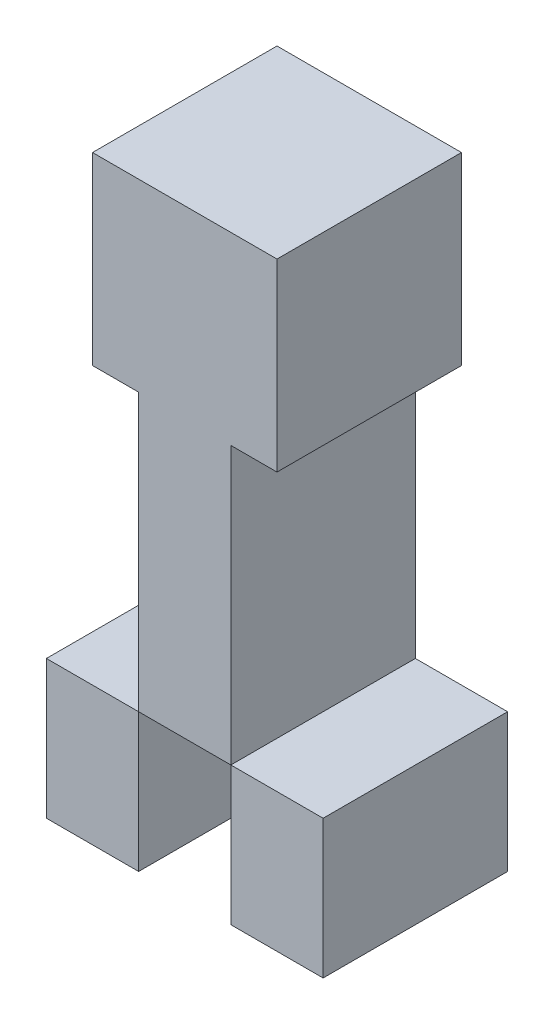
ISO-10303-21;
HEADER;
FILE_DESCRIPTION(('STEP AP214'),'2;1');
FILE_NAME('part.step','',(''),(''),'','','');
FILE_SCHEMA(('AUTOMOTIVE_DESIGN { 1 0 10303 214 1 1 1 1 }'));
ENDSEC;
DATA;
#1=APPLICATION_CONTEXT('core data for automotive mechanical design processes');
#2=APPLICATION_PROTOCOL_DEFINITION('international standard','automotive_design',2000,#1);
#3=PRODUCT_CONTEXT('',#1,'mechanical');
#4=PRODUCT('Part','Part','',(#3));
#5=PRODUCT_RELATED_PRODUCT_CATEGORY('part','',(#4));
#6=PRODUCT_DEFINITION_FORMATION('','',#4);
#7=PRODUCT_DEFINITION_CONTEXT('part definition',#1,'design');
#8=PRODUCT_DEFINITION('design','',#6,#7);
#9=PRODUCT_DEFINITION_SHAPE('','',#8);
#10=(LENGTH_UNIT() NAMED_UNIT(*) SI_UNIT(.MILLI.,.METRE.));
#11=(NAMED_UNIT(*) PLANE_ANGLE_UNIT() SI_UNIT($,.RADIAN.));
#12=(NAMED_UNIT(*) SI_UNIT($,.STERADIAN.) SOLID_ANGLE_UNIT());
#13=UNCERTAINTY_MEASURE_WITH_UNIT(LENGTH_MEASURE(1.E-05),#10,'distance_accuracy_value','');
#14=(GEOMETRIC_REPRESENTATION_CONTEXT(3) GLOBAL_UNCERTAINTY_ASSIGNED_CONTEXT((#13)) GLOBAL_UNIT_ASSIGNED_CONTEXT((#10,
#11,#12)) REPRESENTATION_CONTEXT('',''));
#15=CARTESIAN_POINT('',(0.,0.,0.));
#16=DIRECTION('',(0.,0.,1.));
#17=DIRECTION('',(1.,0.,0.));
#18=AXIS2_PLACEMENT_3D('',#15,#16,#17);
#19=CARTESIAN_POINT('',(0.,114.,0.));
#20=DIRECTION('',(0.,1.,0.));
#21=DIRECTION('',(0.,0.,1.));
#22=AXIS2_PLACEMENT_3D('',#19,#20,#21);
#23=PLANE('',#22);
#24=DIRECTION('',(0.,0.,1.));
#25=VECTOR('',#24,1.);
#26=CARTESIAN_POINT('',(-38.,114.,-152.));
#27=LINE('',#26,#25);
#28=CARTESIAN_POINT('',(-38.,114.,-152.));
#29=VERTEX_POINT('',#28);
#30=CARTESIAN_POINT('',(-38.,114.,0.));
#31=VERTEX_POINT('',#30);
#32=EDGE_CURVE('E208',#29,#31,#27,.T.);
#33=ORIENTED_EDGE('',*,*,#32,.F.);
#34=DIRECTION('',(-1.,0.,0.));
#35=VECTOR('',#34,1.);
#36=CARTESIAN_POINT('',(-38.,114.,-152.));
#37=LINE('',#36,#35);
#38=CARTESIAN_POINT('',(38.,114.,-152.));
#39=VERTEX_POINT('',#38);
#40=EDGE_CURVE('E213',#39,#29,#37,.T.);
#41=ORIENTED_EDGE('',*,*,#40,.F.);
#42=DIRECTION('',(0.,0.,-1.));
#43=VECTOR('',#42,1.);
#44=CARTESIAN_POINT('',(38.,114.,-152.));
#45=LINE('',#44,#43);
#46=CARTESIAN_POINT('',(38.,114.,0.));
#47=VERTEX_POINT('',#46);
#48=EDGE_CURVE('E221',#47,#39,#45,.T.);
#49=ORIENTED_EDGE('',*,*,#48,.F.);
#50=DIRECTION('',(1.,0.,0.));
#51=VECTOR('',#50,1.);
#52=CARTESIAN_POINT('',(-38.,114.,0.));
#53=LINE('',#52,#51);
#54=EDGE_CURVE('E219',#31,#47,#53,.T.);
#55=ORIENTED_EDGE('',*,*,#54,.F.);
#56=EDGE_LOOP('',(#33,#41,#49,#55));
#57=FACE_BOUND('',#56,.T.);
#58=DIRECTION('',(0.,0.,1.));
#59=VECTOR('',#58,1.);
#60=CARTESIAN_POINT('',(-35.,114.,-149.));
#61=LINE('',#60,#59);
#62=CARTESIAN_POINT('',(-35.,114.,-149.));
#63=VERTEX_POINT('',#62);
#64=CARTESIAN_POINT('',(-35.,114.,-3.));
#65=VERTEX_POINT('',#64);
#66=EDGE_CURVE('E71',#63,#65,#61,.T.);
#67=ORIENTED_EDGE('',*,*,#66,.T.);
#68=DIRECTION('',(1.,0.,0.));
#69=VECTOR('',#68,1.);
#70=CARTESIAN_POINT('',(-35.,114.,-3.));
#71=LINE('',#70,#69);
#72=CARTESIAN_POINT('',(35.,114.,-3.));
#73=VERTEX_POINT('',#72);
#74=EDGE_CURVE('E193',#65,#73,#71,.T.);
#75=ORIENTED_EDGE('',*,*,#74,.T.);
#76=DIRECTION('',(0.,0.,-1.));
#77=VECTOR('',#76,1.);
#78=CARTESIAN_POINT('',(35.,114.,-149.));
#79=LINE('',#78,#77);
#80=CARTESIAN_POINT('',(35.,114.,-149.));
#81=VERTEX_POINT('',#80);
#82=EDGE_CURVE('E196',#73,#81,#79,.T.);
#83=ORIENTED_EDGE('',*,*,#82,.T.);
#84=DIRECTION('',(-1.,0.,0.));
#85=VECTOR('',#84,1.);
#86=CARTESIAN_POINT('',(-35.,114.,-149.));
#87=LINE('',#86,#85);
#88=EDGE_CURVE('E184',#81,#63,#87,.T.);
#89=ORIENTED_EDGE('',*,*,#88,.T.);
#90=EDGE_LOOP('',(#67,#75,#83,#89));
#91=FACE_BOUND('',#90,.T.);
#92=ADVANCED_FACE('F48',(#57,#91),#23,.F.);
#93=CARTESIAN_POINT('',(-38.,342.,-152.));
#94=DIRECTION('',(1.,0.,0.));
#95=DIRECTION('',(0.,0.,-1.));
#96=AXIS2_PLACEMENT_3D('',#93,#94,#95);
#97=PLANE('',#96);
#98=ORIENTED_EDGE('',*,*,#32,.T.);
#99=DIRECTION('',(0.,-1.,0.));
#100=VECTOR('',#99,1.);
#101=CARTESIAN_POINT('',(-38.,342.,0.));
#102=LINE('',#101,#100);
#103=CARTESIAN_POINT('',(-38.,342.,0.));
#104=VERTEX_POINT('',#103);
#105=EDGE_CURVE('E12',#104,#31,#102,.T.);
#106=ORIENTED_EDGE('',*,*,#105,.F.);
#107=DIRECTION('',(0.,0.,1.));
#108=VECTOR('',#107,1.);
#109=CARTESIAN_POINT('',(-38.,342.,-152.));
#110=LINE('',#109,#108);
#111=CARTESIAN_POINT('',(-38.,342.,-152.));
#112=VERTEX_POINT('',#111);
#113=EDGE_CURVE('E209',#112,#104,#110,.T.);
#114=ORIENTED_EDGE('',*,*,#113,.F.);
#115=DIRECTION('',(0.,-1.,0.));
#116=VECTOR('',#115,1.);
#117=CARTESIAN_POINT('',(-38.,342.,-152.));
#118=LINE('',#117,#116);
#119=EDGE_CURVE('E216',#112,#29,#118,.T.);
#120=ORIENTED_EDGE('',*,*,#119,.T.);
#121=EDGE_LOOP('',(#98,#106,#114,#120));
#122=FACE_BOUND('',#121,.T.);
#123=ADVANCED_FACE('F50',(#122),#97,.F.);
#124=CARTESIAN_POINT('',(-38.,342.,0.));
#125=DIRECTION('',(0.,0.,-1.));
#126=DIRECTION('',(-1.,0.,0.));
#127=AXIS2_PLACEMENT_3D('',#124,#125,#126);
#128=PLANE('',#127);
#129=ORIENTED_EDGE('',*,*,#54,.T.);
#130=DIRECTION('',(0.,-1.,0.));
#131=VECTOR('',#130,1.);
#132=CARTESIAN_POINT('',(38.,342.,0.));
#133=LINE('',#132,#131);
#134=CARTESIAN_POINT('',(38.,342.,0.));
#135=VERTEX_POINT('',#134);
#136=EDGE_CURVE('E56',#135,#47,#133,.T.);
#137=ORIENTED_EDGE('',*,*,#136,.F.);
#138=DIRECTION('',(1.,0.,0.));
#139=VECTOR('',#138,1.);
#140=CARTESIAN_POINT('',(-76.,342.,0.));
#141=LINE('',#140,#139);
#142=CARTESIAN_POINT('',(76.,342.,0.));
#143=VERTEX_POINT('',#142);
#144=EDGE_CURVE('E246',#135,#143,#141,.T.);
#145=ORIENTED_EDGE('',*,*,#144,.T.);
#146=DIRECTION('',(0.,1.,0.));
#147=VECTOR('',#146,1.);
#148=CARTESIAN_POINT('',(76.,494.,0.));
#149=LINE('',#148,#147);
#150=CARTESIAN_POINT('',(76.,494.,0.));
#151=VERTEX_POINT('',#150);
#152=EDGE_CURVE('E174',#143,#151,#149,.T.);
#153=ORIENTED_EDGE('',*,*,#152,.T.);
#154=DIRECTION('',(-1.,0.,0.));
#155=VECTOR('',#154,1.);
#156=CARTESIAN_POINT('',(-76.,494.,0.));
#157=LINE('',#156,#155);
#158=CARTESIAN_POINT('',(-76.,494.,0.));
#159=VERTEX_POINT('',#158);
#160=EDGE_CURVE('E178',#151,#159,#157,.T.);
#161=ORIENTED_EDGE('',*,*,#160,.T.);
#162=DIRECTION('',(0.,-1.,0.));
#163=VECTOR('',#162,1.);
#164=CARTESIAN_POINT('',(-76.,494.,0.));
#165=LINE('',#164,#163);
#166=CARTESIAN_POINT('',(-76.,342.,0.));
#167=VERTEX_POINT('',#166);
#168=EDGE_CURVE('E146',#159,#167,#165,.T.);
#169=ORIENTED_EDGE('',*,*,#168,.T.);
#170=EDGE_CURVE('E245',#167,#104,#141,.T.);
#171=ORIENTED_EDGE('',*,*,#170,.T.);
#172=ORIENTED_EDGE('',*,*,#105,.T.);
#173=EDGE_LOOP('',(#129,#137,#145,#153,#161,#169,#171,#172));
#174=FACE_BOUND('',#173,.T.);
#175=ADVANCED_FACE('F249',(#174),#128,.F.);
#176=CARTESIAN_POINT('',(38.,342.,-152.));
#177=DIRECTION('',(-1.,0.,0.));
#178=DIRECTION('',(0.,0.,1.));
#179=AXIS2_PLACEMENT_3D('',#176,#177,#178);
#180=PLANE('',#179);
#181=ORIENTED_EDGE('',*,*,#48,.T.);
#182=DIRECTION('',(0.,-1.,0.));
#183=VECTOR('',#182,1.);
#184=CARTESIAN_POINT('',(38.,342.,-152.));
#185=LINE('',#184,#183);
#186=CARTESIAN_POINT('',(38.,342.,-152.));
#187=VERTEX_POINT('',#186);
#188=EDGE_CURVE('E226',#187,#39,#185,.T.);
#189=ORIENTED_EDGE('',*,*,#188,.F.);
#190=DIRECTION('',(0.,0.,-1.));
#191=VECTOR('',#190,1.);
#192=CARTESIAN_POINT('',(38.,342.,-152.));
#193=LINE('',#192,#191);
#194=EDGE_CURVE('E212',#135,#187,#193,.T.);
#195=ORIENTED_EDGE('',*,*,#194,.F.);
#196=ORIENTED_EDGE('',*,*,#136,.T.);
#197=EDGE_LOOP('',(#181,#189,#195,#196));
#198=FACE_BOUND('',#197,.T.);
#199=ADVANCED_FACE('F232',(#198),#180,.F.);
#200=CARTESIAN_POINT('',(-38.,342.,-152.));
#201=DIRECTION('',(0.,0.,1.));
#202=DIRECTION('',(1.,0.,0.));
#203=AXIS2_PLACEMENT_3D('',#200,#201,#202);
#204=PLANE('',#203);
#205=ORIENTED_EDGE('',*,*,#40,.T.);
#206=ORIENTED_EDGE('',*,*,#119,.F.);
#207=DIRECTION('',(-1.,0.,0.));
#208=VECTOR('',#207,1.);
#209=CARTESIAN_POINT('',(-76.,342.,-152.));
#210=LINE('',#209,#208);
#211=CARTESIAN_POINT('',(-76.,342.,-152.));
#212=VERTEX_POINT('',#211);
#213=EDGE_CURVE('E163',#112,#212,#210,.T.);
#214=ORIENTED_EDGE('',*,*,#213,.T.);
#215=DIRECTION('',(0.,1.,0.));
#216=VECTOR('',#215,1.);
#217=CARTESIAN_POINT('',(-76.,494.,-152.));
#218=LINE('',#217,#216);
#219=CARTESIAN_POINT('',(-76.,494.,-152.));
#220=VERTEX_POINT('',#219);
#221=EDGE_CURVE('E145',#212,#220,#218,.T.);
#222=ORIENTED_EDGE('',*,*,#221,.T.);
#223=DIRECTION('',(1.,0.,0.));
#224=VECTOR('',#223,1.);
#225=CARTESIAN_POINT('',(-76.,494.,-152.));
#226=LINE('',#225,#224);
#227=CARTESIAN_POINT('',(76.,494.,-152.));
#228=VERTEX_POINT('',#227);
#229=EDGE_CURVE('E153',#220,#228,#226,.T.);
#230=ORIENTED_EDGE('',*,*,#229,.T.);
#231=DIRECTION('',(0.,-1.,0.));
#232=VECTOR('',#231,1.);
#233=CARTESIAN_POINT('',(76.,494.,-152.));
#234=LINE('',#233,#232);
#235=CARTESIAN_POINT('',(76.,342.,-152.));
#236=VERTEX_POINT('',#235);
#237=EDGE_CURVE('E159',#228,#236,#234,.T.);
#238=ORIENTED_EDGE('',*,*,#237,.T.);
#239=EDGE_CURVE('E150',#236,#187,#210,.T.);
#240=ORIENTED_EDGE('',*,*,#239,.T.);
#241=ORIENTED_EDGE('',*,*,#188,.T.);
#242=EDGE_LOOP('',(#205,#206,#214,#222,#230,#238,#240,#241));
#243=FACE_BOUND('',#242,.T.);
#244=ADVANCED_FACE('F161',(#243),#204,.F.);
#245=CARTESIAN_POINT('',(-35.,342.,-149.));
#246=DIRECTION('',(1.,0.,0.));
#247=DIRECTION('',(0.,0.,-1.));
#248=AXIS2_PLACEMENT_3D('',#245,#246,#247);
#249=PLANE('',#248);
#250=ORIENTED_EDGE('',*,*,#66,.F.);
#251=DIRECTION('',(0.,-1.,0.));
#252=VECTOR('',#251,1.);
#253=CARTESIAN_POINT('',(-35.,342.,-149.));
#254=LINE('',#253,#252);
#255=CARTESIAN_POINT('',(-35.,342.,-149.));
#256=VERTEX_POINT('',#255);
#257=EDGE_CURVE('E191',#256,#63,#254,.T.);
#258=ORIENTED_EDGE('',*,*,#257,.F.);
#259=DIRECTION('',(0.,0.,1.));
#260=VECTOR('',#259,1.);
#261=CARTESIAN_POINT('',(-35.,342.,-149.));
#262=LINE('',#261,#260);
#263=CARTESIAN_POINT('',(-35.,342.,-3.));
#264=VERTEX_POINT('',#263);
#265=EDGE_CURVE('E180',#256,#264,#262,.T.);
#266=ORIENTED_EDGE('',*,*,#265,.T.);
#267=DIRECTION('',(0.,-1.,0.));
#268=VECTOR('',#267,1.);
#269=CARTESIAN_POINT('',(-35.,342.,-3.));
#270=LINE('',#269,#268);
#271=EDGE_CURVE('E206',#264,#65,#270,.T.);
#272=ORIENTED_EDGE('',*,*,#271,.T.);
#273=EDGE_LOOP('',(#250,#258,#266,#272));
#274=FACE_BOUND('',#273,.T.);
#275=ADVANCED_FACE('F275',(#274),#249,.T.);
#276=CARTESIAN_POINT('',(-35.,342.,-3.));
#277=DIRECTION('',(0.,0.,-1.));
#278=DIRECTION('',(-1.,0.,0.));
#279=AXIS2_PLACEMENT_3D('',#276,#277,#278);
#280=PLANE('',#279);
#281=ORIENTED_EDGE('',*,*,#74,.F.);
#282=ORIENTED_EDGE('',*,*,#271,.F.);
#283=DIRECTION('',(1.,0.,0.));
#284=VECTOR('',#283,1.);
#285=CARTESIAN_POINT('',(-35.,342.,-3.));
#286=LINE('',#285,#284);
#287=CARTESIAN_POINT('',(35.,342.,-3.));
#288=VERTEX_POINT('',#287);
#289=EDGE_CURVE('E183',#264,#288,#286,.T.);
#290=ORIENTED_EDGE('',*,*,#289,.T.);
#291=DIRECTION('',(0.,-1.,0.));
#292=VECTOR('',#291,1.);
#293=CARTESIAN_POINT('',(35.,342.,-3.));
#294=LINE('',#293,#292);
#295=EDGE_CURVE('E204',#288,#73,#294,.T.);
#296=ORIENTED_EDGE('',*,*,#295,.T.);
#297=EDGE_LOOP('',(#281,#282,#290,#296));
#298=FACE_BOUND('',#297,.T.);
#299=ADVANCED_FACE('F299',(#298),#280,.T.);
#300=CARTESIAN_POINT('',(35.,342.,-149.));
#301=DIRECTION('',(-1.,0.,0.));
#302=DIRECTION('',(0.,0.,1.));
#303=AXIS2_PLACEMENT_3D('',#300,#301,#302);
#304=PLANE('',#303);
#305=ORIENTED_EDGE('',*,*,#82,.F.);
#306=ORIENTED_EDGE('',*,*,#295,.F.);
#307=DIRECTION('',(0.,0.,-1.));
#308=VECTOR('',#307,1.);
#309=CARTESIAN_POINT('',(35.,342.,-149.));
#310=LINE('',#309,#308);
#311=CARTESIAN_POINT('',(35.,342.,-149.));
#312=VERTEX_POINT('',#311);
#313=EDGE_CURVE('E187',#288,#312,#310,.T.);
#314=ORIENTED_EDGE('',*,*,#313,.T.);
#315=DIRECTION('',(0.,-1.,0.));
#316=VECTOR('',#315,1.);
#317=CARTESIAN_POINT('',(35.,342.,-149.));
#318=LINE('',#317,#316);
#319=EDGE_CURVE('E202',#312,#81,#318,.T.);
#320=ORIENTED_EDGE('',*,*,#319,.T.);
#321=EDGE_LOOP('',(#305,#306,#314,#320));
#322=FACE_BOUND('',#321,.T.);
#323=ADVANCED_FACE('F305',(#322),#304,.T.);
#324=CARTESIAN_POINT('',(-35.,342.,-149.));
#325=DIRECTION('',(0.,0.,1.));
#326=DIRECTION('',(1.,0.,0.));
#327=AXIS2_PLACEMENT_3D('',#324,#325,#326);
#328=PLANE('',#327);
#329=ORIENTED_EDGE('',*,*,#88,.F.);
#330=ORIENTED_EDGE('',*,*,#319,.F.);
#331=DIRECTION('',(-1.,0.,0.));
#332=VECTOR('',#331,1.);
#333=CARTESIAN_POINT('',(-35.,342.,-149.));
#334=LINE('',#333,#332);
#335=EDGE_CURVE('E63',#312,#256,#334,.T.);
#336=ORIENTED_EDGE('',*,*,#335,.T.);
#337=ORIENTED_EDGE('',*,*,#257,.T.);
#338=EDGE_LOOP('',(#329,#330,#336,#337));
#339=FACE_BOUND('',#338,.T.);
#340=ADVANCED_FACE('F267',(#339),#328,.T.);
#341=CARTESIAN_POINT('',(-76.,342.,214.96046148071));
#342=DIRECTION('',(0.,-1.,0.));
#343=DIRECTION('',(0.,0.,-1.));
#344=AXIS2_PLACEMENT_3D('',#341,#342,#343);
#345=PLANE('',#344);
#346=ORIENTED_EDGE('',*,*,#289,.F.);
#347=ORIENTED_EDGE('',*,*,#265,.F.);
#348=ORIENTED_EDGE('',*,*,#335,.F.);
#349=ORIENTED_EDGE('',*,*,#313,.F.);
#350=EDGE_LOOP('',(#346,#347,#348,#349));
#351=FACE_BOUND('',#350,.T.);
#352=ADVANCED_FACE('F258',(#351),#345,.T.);
#353=ORIENTED_EDGE('',*,*,#213,.F.);
#354=ORIENTED_EDGE('',*,*,#113,.T.);
#355=ORIENTED_EDGE('',*,*,#170,.F.);
#356=DIRECTION('',(0.,0.,-1.));
#357=VECTOR('',#356,1.);
#358=CARTESIAN_POINT('',(-76.,342.,214.96046148071));
#359=LINE('',#358,#357);
#360=EDGE_CURVE('E172',#167,#212,#359,.T.);
#361=ORIENTED_EDGE('',*,*,#360,.T.);
#362=EDGE_LOOP('',(#353,#354,#355,#361));
#363=FACE_BOUND('',#362,.T.);
#364=ADVANCED_FACE('F244',(#363),#345,.T.);
#365=CARTESIAN_POINT('',(-76.,494.,214.96046148071));
#366=DIRECTION('',(-1.,0.,0.));
#367=DIRECTION('',(0.,-1.,0.));
#368=AXIS2_PLACEMENT_3D('',#365,#366,#367);
#369=PLANE('',#368);
#370=ORIENTED_EDGE('',*,*,#168,.F.);
#371=DIRECTION('',(0.,0.,-1.));
#372=VECTOR('',#371,1.);
#373=CARTESIAN_POINT('',(-76.,494.,214.96046148071));
#374=LINE('',#373,#372);
#375=EDGE_CURVE('E140',#159,#220,#374,.T.);
#376=ORIENTED_EDGE('',*,*,#375,.T.);
#377=ORIENTED_EDGE('',*,*,#221,.F.);
#378=ORIENTED_EDGE('',*,*,#360,.F.);
#379=EDGE_LOOP('',(#370,#376,#377,#378));
#380=FACE_BOUND('',#379,.T.);
#381=ADVANCED_FACE('F142',(#380),#369,.T.);
#382=ORIENTED_EDGE('',*,*,#144,.F.);
#383=ORIENTED_EDGE('',*,*,#194,.T.);
#384=ORIENTED_EDGE('',*,*,#239,.F.);
#385=DIRECTION('',(0.,0.,-1.));
#386=VECTOR('',#385,1.);
#387=CARTESIAN_POINT('',(76.,342.,214.96046148071));
#388=LINE('',#387,#386);
#389=EDGE_CURVE('E175',#143,#236,#388,.T.);
#390=ORIENTED_EDGE('',*,*,#389,.F.);
#391=EDGE_LOOP('',(#382,#383,#384,#390));
#392=FACE_BOUND('',#391,.T.);
#393=ADVANCED_FACE('F255',(#392),#345,.T.);
#394=CARTESIAN_POINT('',(76.,494.,214.96046148071));
#395=DIRECTION('',(1.,0.,0.));
#396=DIRECTION('',(0.,1.,0.));
#397=AXIS2_PLACEMENT_3D('',#394,#395,#396);
#398=PLANE('',#397);
#399=ORIENTED_EDGE('',*,*,#152,.F.);
#400=ORIENTED_EDGE('',*,*,#389,.T.);
#401=ORIENTED_EDGE('',*,*,#237,.F.);
#402=DIRECTION('',(0.,0.,-1.));
#403=VECTOR('',#402,1.);
#404=CARTESIAN_POINT('',(76.,494.,214.96046148071));
#405=LINE('',#404,#403);
#406=EDGE_CURVE('E149',#151,#228,#405,.T.);
#407=ORIENTED_EDGE('',*,*,#406,.F.);
#408=EDGE_LOOP('',(#399,#400,#401,#407));
#409=FACE_BOUND('',#408,.T.);
#410=ADVANCED_FACE('F252',(#409),#398,.T.);
#411=CARTESIAN_POINT('',(-76.,494.,214.96046148071));
#412=DIRECTION('',(0.,1.,0.));
#413=DIRECTION('',(-1.,0.,0.));
#414=AXIS2_PLACEMENT_3D('',#411,#412,#413);
#415=PLANE('',#414);
#416=ORIENTED_EDGE('',*,*,#160,.F.);
#417=ORIENTED_EDGE('',*,*,#406,.T.);
#418=ORIENTED_EDGE('',*,*,#229,.F.);
#419=ORIENTED_EDGE('',*,*,#375,.F.);
#420=EDGE_LOOP('',(#416,#417,#418,#419));
#421=FACE_BOUND('',#420,.T.);
#422=ADVANCED_FACE('F154',(#421),#415,.T.);
#423=CLOSED_SHELL('',(#92,#123,#175,#199,#244,#275,#299,#323,#340,#352,#364,#381,#393,#410,#422));
#424=MANIFOLD_SOLID_BREP('B2',#423);
#425=CARTESIAN_POINT('',(111.,114.,-3.));
#426=DIRECTION('',(-1.,0.,0.));
#427=DIRECTION('',(0.,0.,-1.));
#428=AXIS2_PLACEMENT_3D('',#425,#426,#427);
#429=PLANE('',#428);
#430=DIRECTION('',(0.,-1.,0.));
#431=VECTOR('',#430,1.);
#432=CARTESIAN_POINT('',(111.,114.,-149.));
#433=LINE('',#432,#431);
#434=CARTESIAN_POINT('',(111.,111.,-149.));
#435=VERTEX_POINT('',#434);
#436=CARTESIAN_POINT('',(111.,0.,-149.));
#437=VERTEX_POINT('',#436);
#438=EDGE_CURVE('E500',#435,#437,#433,.T.);
#439=ORIENTED_EDGE('',*,*,#438,.T.);
#440=DIRECTION('',(0.,0.,1.));
#441=VECTOR('',#440,1.);
#442=CARTESIAN_POINT('',(111.,0.,-3.));
#443=LINE('',#442,#441);
#444=CARTESIAN_POINT('',(111.,0.,-3.));
#445=VERTEX_POINT('',#444);
#446=EDGE_CURVE('E685',#437,#445,#443,.T.);
#447=ORIENTED_EDGE('',*,*,#446,.T.);
#448=DIRECTION('',(0.,-1.,0.));
#449=VECTOR('',#448,1.);
#450=CARTESIAN_POINT('',(111.,114.,-3.));
#451=LINE('',#450,#449);
#452=CARTESIAN_POINT('',(111.,111.,-2.99999999999999));
#453=VERTEX_POINT('',#452);
#454=EDGE_CURVE('E515',#453,#445,#451,.T.);
#455=ORIENTED_EDGE('',*,*,#454,.F.);
#456=DIRECTION('',(0.,0.,-1.));
#457=VECTOR('',#456,1.);
#458=CARTESIAN_POINT('',(111.,111.,67.0642562224133));
#459=LINE('',#458,#457);
#460=EDGE_CURVE('E509',#453,#435,#459,.T.);
#461=ORIENTED_EDGE('',*,*,#460,.T.);
#462=EDGE_LOOP('',(#439,#447,#455,#461));
#463=FACE_BOUND('',#462,.T.);
#464=ADVANCED_FACE('F432',(#463),#429,.T.);
#465=CARTESIAN_POINT('',(111.,114.,-3.));
#466=DIRECTION('',(0.,0.,-1.));
#467=DIRECTION('',(1.,0.,0.));
#468=AXIS2_PLACEMENT_3D('',#465,#466,#467);
#469=PLANE('',#468);
#470=ORIENTED_EDGE('',*,*,#454,.T.);
#471=DIRECTION('',(-1.,0.,0.));
#472=VECTOR('',#471,1.);
#473=CARTESIAN_POINT('',(111.,0.,-3.));
#474=LINE('',#473,#472);
#475=CARTESIAN_POINT('',(41.,0.,-3.));
#476=VERTEX_POINT('',#475);
#477=EDGE_CURVE('E690',#445,#476,#474,.T.);
#478=ORIENTED_EDGE('',*,*,#477,.T.);
#479=DIRECTION('',(0.,-1.,0.));
#480=VECTOR('',#479,1.);
#481=CARTESIAN_POINT('',(41.,114.,-3.));
#482=LINE('',#481,#480);
#483=CARTESIAN_POINT('',(41.,111.,-2.99999999999999));
#484=VERTEX_POINT('',#483);
#485=EDGE_CURVE('E513',#484,#476,#482,.T.);
#486=ORIENTED_EDGE('',*,*,#485,.F.);
#487=DIRECTION('',(1.,0.,0.));
#488=VECTOR('',#487,1.);
#489=CARTESIAN_POINT('',(111.,111.,-2.99999999999999));
#490=LINE('',#489,#488);
#491=EDGE_CURVE('E505',#484,#453,#490,.T.);
#492=ORIENTED_EDGE('',*,*,#491,.T.);
#493=EDGE_LOOP('',(#470,#478,#486,#492));
#494=FACE_BOUND('',#493,.T.);
#495=ADVANCED_FACE('F579',(#494),#469,.T.);
#496=CARTESIAN_POINT('',(41.,114.,-3.));
#497=DIRECTION('',(1.,0.,0.));
#498=DIRECTION('',(0.,0.,1.));
#499=AXIS2_PLACEMENT_3D('',#496,#497,#498);
#500=PLANE('',#499);
#501=ORIENTED_EDGE('',*,*,#485,.T.);
#502=DIRECTION('',(0.,0.,-1.));
#503=VECTOR('',#502,1.);
#504=CARTESIAN_POINT('',(41.,0.,-3.));
#505=LINE('',#504,#503);
#506=CARTESIAN_POINT('',(41.,0.,-149.));
#507=VERTEX_POINT('',#506);
#508=EDGE_CURVE('E512',#476,#507,#505,.T.);
#509=ORIENTED_EDGE('',*,*,#508,.T.);
#510=DIRECTION('',(0.,-1.,0.));
#511=VECTOR('',#510,1.);
#512=CARTESIAN_POINT('',(41.,114.,-149.));
#513=LINE('',#512,#511);
#514=CARTESIAN_POINT('',(41.,111.,-149.));
#515=VERTEX_POINT('',#514);
#516=EDGE_CURVE('E497',#515,#507,#513,.T.);
#517=ORIENTED_EDGE('',*,*,#516,.F.);
#518=DIRECTION('',(0.,0.,-1.));
#519=VECTOR('',#518,1.);
#520=CARTESIAN_POINT('',(41.,111.,67.0642562224133));
#521=LINE('',#520,#519);
#522=EDGE_CURVE('E501',#484,#515,#521,.T.);
#523=ORIENTED_EDGE('',*,*,#522,.F.);
#524=EDGE_LOOP('',(#501,#509,#517,#523));
#525=FACE_BOUND('',#524,.T.);
#526=ADVANCED_FACE('F511',(#525),#500,.T.);
#527=CARTESIAN_POINT('',(111.,114.,-149.));
#528=DIRECTION('',(0.,0.,1.));
#529=DIRECTION('',(-1.,0.,0.));
#530=AXIS2_PLACEMENT_3D('',#527,#528,#529);
#531=PLANE('',#530);
#532=ORIENTED_EDGE('',*,*,#516,.T.);
#533=DIRECTION('',(1.,0.,0.));
#534=VECTOR('',#533,1.);
#535=CARTESIAN_POINT('',(111.,0.,-149.));
#536=LINE('',#535,#534);
#537=EDGE_CURVE('E455',#507,#437,#536,.T.);
#538=ORIENTED_EDGE('',*,*,#537,.T.);
#539=ORIENTED_EDGE('',*,*,#438,.F.);
#540=DIRECTION('',(-1.,0.,0.));
#541=VECTOR('',#540,1.);
#542=CARTESIAN_POINT('',(111.,111.,-149.));
#543=LINE('',#542,#541);
#544=EDGE_CURVE('E447',#435,#515,#543,.T.);
#545=ORIENTED_EDGE('',*,*,#544,.T.);
#546=EDGE_LOOP('',(#532,#538,#539,#545));
#547=FACE_BOUND('',#546,.T.);
#548=ADVANCED_FACE('F495',(#547),#531,.T.);
#549=CARTESIAN_POINT('',(0.,114.,0.));
#550=DIRECTION('',(0.,-1.,0.));
#551=DIRECTION('',(0.,0.,-1.));
#552=AXIS2_PLACEMENT_3D('',#549,#550,#551);
#553=PLANE('',#552);
#554=DIRECTION('',(0.,0.,1.));
#555=VECTOR('',#554,1.);
#556=CARTESIAN_POINT('',(114.,114.,0.));
#557=LINE('',#556,#555);
#558=CARTESIAN_POINT('',(114.,114.,-152.));
#559=VERTEX_POINT('',#558);
#560=CARTESIAN_POINT('',(114.,114.,0.));
#561=VERTEX_POINT('',#560);
#562=EDGE_CURVE('E523',#559,#561,#557,.T.);
#563=ORIENTED_EDGE('',*,*,#562,.F.);
#564=DIRECTION('',(1.,0.,0.));
#565=VECTOR('',#564,1.);
#566=CARTESIAN_POINT('',(114.,114.,-152.));
#567=LINE('',#566,#565);
#568=CARTESIAN_POINT('',(38.,114.,-152.));
#569=VERTEX_POINT('',#568);
#570=EDGE_CURVE('E533',#569,#559,#567,.T.);
#571=ORIENTED_EDGE('',*,*,#570,.F.);
#572=DIRECTION('',(0.,0.,-1.));
#573=VECTOR('',#572,1.);
#574=CARTESIAN_POINT('',(38.,114.,0.));
#575=LINE('',#574,#573);
#576=CARTESIAN_POINT('',(38.,114.,0.));
#577=VERTEX_POINT('',#576);
#578=EDGE_CURVE('E530',#577,#569,#575,.T.);
#579=ORIENTED_EDGE('',*,*,#578,.F.);
#580=DIRECTION('',(-1.,0.,0.));
#581=VECTOR('',#580,1.);
#582=CARTESIAN_POINT('',(114.,114.,0.));
#583=LINE('',#582,#581);
#584=EDGE_CURVE('E526',#561,#577,#583,.T.);
#585=ORIENTED_EDGE('',*,*,#584,.F.);
#586=EDGE_LOOP('',(#563,#571,#579,#585));
#587=FACE_BOUND('',#586,.T.);
#588=ADVANCED_FACE('F565',(#587),#553,.F.);
#589=CARTESIAN_POINT('',(0.,0.,0.));
#590=DIRECTION('',(0.,-1.,0.));
#591=DIRECTION('',(0.,0.,-1.));
#592=AXIS2_PLACEMENT_3D('',#589,#590,#591);
#593=PLANE('',#592);
#594=DIRECTION('',(0.,0.,1.));
#595=VECTOR('',#594,1.);
#596=CARTESIAN_POINT('',(114.,0.,0.));
#597=LINE('',#596,#595);
#598=CARTESIAN_POINT('',(114.,0.,-152.));
#599=VERTEX_POINT('',#598);
#600=CARTESIAN_POINT('',(114.,0.,0.));
#601=VERTEX_POINT('',#600);
#602=EDGE_CURVE('E522',#599,#601,#597,.T.);
#603=ORIENTED_EDGE('',*,*,#602,.T.);
#604=DIRECTION('',(-1.,0.,0.));
#605=VECTOR('',#604,1.);
#606=CARTESIAN_POINT('',(114.,0.,0.));
#607=LINE('',#606,#605);
#608=CARTESIAN_POINT('',(38.,0.,0.));
#609=VERTEX_POINT('',#608);
#610=EDGE_CURVE('E539',#601,#609,#607,.T.);
#611=ORIENTED_EDGE('',*,*,#610,.T.);
#612=DIRECTION('',(0.,0.,-1.));
#613=VECTOR('',#612,1.);
#614=CARTESIAN_POINT('',(38.,0.,0.));
#615=LINE('',#614,#613);
#616=CARTESIAN_POINT('',(38.,0.,-152.));
#617=VERTEX_POINT('',#616);
#618=EDGE_CURVE('E542',#609,#617,#615,.T.);
#619=ORIENTED_EDGE('',*,*,#618,.T.);
#620=DIRECTION('',(1.,0.,0.));
#621=VECTOR('',#620,1.);
#622=CARTESIAN_POINT('',(114.,0.,-152.));
#623=LINE('',#622,#621);
#624=EDGE_CURVE('E527',#617,#599,#623,.T.);
#625=ORIENTED_EDGE('',*,*,#624,.T.);
#626=EDGE_LOOP('',(#603,#611,#619,#625));
#627=FACE_BOUND('',#626,.T.);
#628=ORIENTED_EDGE('',*,*,#537,.F.);
#629=ORIENTED_EDGE('',*,*,#508,.F.);
#630=ORIENTED_EDGE('',*,*,#477,.F.);
#631=ORIENTED_EDGE('',*,*,#446,.F.);
#632=EDGE_LOOP('',(#628,#629,#630,#631));
#633=FACE_BOUND('',#632,.T.);
#634=ADVANCED_FACE('F559',(#627,#633),#593,.T.);
#635=CARTESIAN_POINT('',(114.,114.,0.));
#636=DIRECTION('',(-1.,0.,0.));
#637=DIRECTION('',(0.,0.,-1.));
#638=AXIS2_PLACEMENT_3D('',#635,#636,#637);
#639=PLANE('',#638);
#640=ORIENTED_EDGE('',*,*,#602,.F.);
#641=DIRECTION('',(0.,-1.,0.));
#642=VECTOR('',#641,1.);
#643=CARTESIAN_POINT('',(114.,114.,-152.));
#644=LINE('',#643,#642);
#645=EDGE_CURVE('E536',#559,#599,#644,.T.);
#646=ORIENTED_EDGE('',*,*,#645,.F.);
#647=ORIENTED_EDGE('',*,*,#562,.T.);
#648=DIRECTION('',(0.,-1.,0.));
#649=VECTOR('',#648,1.);
#650=CARTESIAN_POINT('',(114.,114.,0.));
#651=LINE('',#650,#649);
#652=EDGE_CURVE('E46',#561,#601,#651,.T.);
#653=ORIENTED_EDGE('',*,*,#652,.T.);
#654=EDGE_LOOP('',(#640,#646,#647,#653));
#655=FACE_BOUND('',#654,.T.);
#656=ADVANCED_FACE('F434',(#655),#639,.F.);
#657=CARTESIAN_POINT('',(114.,114.,0.));
#658=DIRECTION('',(0.,0.,-1.));
#659=DIRECTION('',(1.,0.,0.));
#660=AXIS2_PLACEMENT_3D('',#657,#658,#659);
#661=PLANE('',#660);
#662=ORIENTED_EDGE('',*,*,#610,.F.);
#663=ORIENTED_EDGE('',*,*,#652,.F.);
#664=ORIENTED_EDGE('',*,*,#584,.T.);
#665=DIRECTION('',(0.,-1.,0.));
#666=VECTOR('',#665,1.);
#667=CARTESIAN_POINT('',(38.,114.,0.));
#668=LINE('',#667,#666);
#669=EDGE_CURVE('E440',#577,#609,#668,.T.);
#670=ORIENTED_EDGE('',*,*,#669,.T.);
#671=EDGE_LOOP('',(#662,#663,#664,#670));
#672=FACE_BOUND('',#671,.T.);
#673=ADVANCED_FACE('F552',(#672),#661,.F.);
#674=CARTESIAN_POINT('',(38.,114.,0.));
#675=DIRECTION('',(1.,0.,0.));
#676=DIRECTION('',(0.,0.,1.));
#677=AXIS2_PLACEMENT_3D('',#674,#675,#676);
#678=PLANE('',#677);
#679=ORIENTED_EDGE('',*,*,#618,.F.);
#680=ORIENTED_EDGE('',*,*,#669,.F.);
#681=ORIENTED_EDGE('',*,*,#578,.T.);
#682=DIRECTION('',(0.,-1.,0.));
#683=VECTOR('',#682,1.);
#684=CARTESIAN_POINT('',(38.,114.,-152.));
#685=LINE('',#684,#683);
#686=EDGE_CURVE('E548',#569,#617,#685,.T.);
#687=ORIENTED_EDGE('',*,*,#686,.T.);
#688=EDGE_LOOP('',(#679,#680,#681,#687));
#689=FACE_BOUND('',#688,.T.);
#690=ADVANCED_FACE('F556',(#689),#678,.F.);
#691=CARTESIAN_POINT('',(114.,114.,-152.));
#692=DIRECTION('',(0.,0.,1.));
#693=DIRECTION('',(-1.,0.,0.));
#694=AXIS2_PLACEMENT_3D('',#691,#692,#693);
#695=PLANE('',#694);
#696=ORIENTED_EDGE('',*,*,#624,.F.);
#697=ORIENTED_EDGE('',*,*,#686,.F.);
#698=ORIENTED_EDGE('',*,*,#570,.T.);
#699=ORIENTED_EDGE('',*,*,#645,.T.);
#700=EDGE_LOOP('',(#696,#697,#698,#699));
#701=FACE_BOUND('',#700,.T.);
#702=ADVANCED_FACE('F568',(#701),#695,.F.);
#703=CARTESIAN_POINT('',(111.,111.,67.0642562224133));
#704=DIRECTION('',(0.,1.,0.));
#705=DIRECTION('',(0.,0.,1.));
#706=AXIS2_PLACEMENT_3D('',#703,#704,#705);
#707=PLANE('',#706);
#708=ORIENTED_EDGE('',*,*,#522,.T.);
#709=ORIENTED_EDGE('',*,*,#544,.F.);
#710=ORIENTED_EDGE('',*,*,#460,.F.);
#711=ORIENTED_EDGE('',*,*,#491,.F.);
#712=EDGE_LOOP('',(#708,#709,#710,#711));
#713=FACE_BOUND('',#712,.T.);
#714=ADVANCED_FACE('F504',(#713),#707,.F.);
#715=CLOSED_SHELL('',(#464,#495,#526,#548,#588,#634,#656,#673,#690,#702,#714));
#716=MANIFOLD_SOLID_BREP('B6',#715);
#717=CARTESIAN_POINT('',(-111.,114.,-3.));
#718=DIRECTION('',(1.,0.,0.));
#719=DIRECTION('',(0.,0.,-1.));
#720=AXIS2_PLACEMENT_3D('',#717,#718,#719);
#721=PLANE('',#720);
#722=DIRECTION('',(0.,-1.,0.));
#723=VECTOR('',#722,1.);
#724=CARTESIAN_POINT('',(-111.,114.,-149.));
#725=LINE('',#724,#723);
#726=CARTESIAN_POINT('',(-111.,111.,-149.));
#727=VERTEX_POINT('',#726);
#728=CARTESIAN_POINT('',(-111.,0.,-149.));
#729=VERTEX_POINT('',#728);
#730=EDGE_CURVE('E718',#727,#729,#725,.T.);
#731=ORIENTED_EDGE('',*,*,#730,.F.);
#732=DIRECTION('',(0.,0.,-1.));
#733=VECTOR('',#732,1.);
#734=CARTESIAN_POINT('',(-111.,111.,67.0642562224133));
#735=LINE('',#734,#733);
#736=CARTESIAN_POINT('',(-111.,111.,-2.99999999999999));
#737=VERTEX_POINT('',#736);
#738=EDGE_CURVE('E711',#737,#727,#735,.T.);
#739=ORIENTED_EDGE('',*,*,#738,.F.);
#740=DIRECTION('',(0.,-1.,0.));
#741=VECTOR('',#740,1.);
#742=CARTESIAN_POINT('',(-111.,114.,-3.));
#743=LINE('',#742,#741);
#744=CARTESIAN_POINT('',(-111.,0.,-3.));
#745=VERTEX_POINT('',#744);
#746=EDGE_CURVE('E778',#737,#745,#743,.T.);
#747=ORIENTED_EDGE('',*,*,#746,.T.);
#748=DIRECTION('',(0.,0.,1.));
#749=VECTOR('',#748,1.);
#750=CARTESIAN_POINT('',(-111.,0.,-3.));
#751=LINE('',#750,#749);
#752=EDGE_CURVE('E946',#729,#745,#751,.T.);
#753=ORIENTED_EDGE('',*,*,#752,.F.);
#754=EDGE_LOOP('',(#731,#739,#747,#753));
#755=FACE_BOUND('',#754,.T.);
#756=ADVANCED_FACE('F696',(#755),#721,.T.);
#757=CARTESIAN_POINT('',(-111.,114.,-3.));
#758=DIRECTION('',(0.,0.,-1.));
#759=DIRECTION('',(-1.,0.,0.));
#760=AXIS2_PLACEMENT_3D('',#757,#758,#759);
#761=PLANE('',#760);
#762=ORIENTED_EDGE('',*,*,#746,.F.);
#763=DIRECTION('',(-1.,0.,0.));
#764=VECTOR('',#763,1.);
#765=CARTESIAN_POINT('',(-111.,111.,-2.99999999999999));
#766=LINE('',#765,#764);
#767=CARTESIAN_POINT('',(-41.,111.,-2.99999999999999));
#768=VERTEX_POINT('',#767);
#769=EDGE_CURVE('E950',#768,#737,#766,.T.);
#770=ORIENTED_EDGE('',*,*,#769,.F.);
#771=DIRECTION('',(0.,-1.,0.));
#772=VECTOR('',#771,1.);
#773=CARTESIAN_POINT('',(-41.,114.,-3.));
#774=LINE('',#773,#772);
#775=CARTESIAN_POINT('',(-41.,0.,-3.));
#776=VERTEX_POINT('',#775);
#777=EDGE_CURVE('E771',#768,#776,#774,.T.);
#778=ORIENTED_EDGE('',*,*,#777,.T.);
#779=DIRECTION('',(1.,0.,0.));
#780=VECTOR('',#779,1.);
#781=CARTESIAN_POINT('',(-111.,0.,-3.));
#782=LINE('',#781,#780);
#783=EDGE_CURVE('E949',#745,#776,#782,.T.);
#784=ORIENTED_EDGE('',*,*,#783,.F.);
#785=EDGE_LOOP('',(#762,#770,#778,#784));
#786=FACE_BOUND('',#785,.T.);
#787=ADVANCED_FACE('F837',(#786),#761,.T.);
#788=CARTESIAN_POINT('',(-41.,114.,-3.));
#789=DIRECTION('',(-1.,0.,0.));
#790=DIRECTION('',(0.,0.,1.));
#791=AXIS2_PLACEMENT_3D('',#788,#789,#790);
#792=PLANE('',#791);
#793=ORIENTED_EDGE('',*,*,#777,.F.);
#794=DIRECTION('',(0.,0.,-1.));
#795=VECTOR('',#794,1.);
#796=CARTESIAN_POINT('',(-41.,111.,67.0642562224133));
#797=LINE('',#796,#795);
#798=CARTESIAN_POINT('',(-41.,111.,-149.));
#799=VERTEX_POINT('',#798);
#800=EDGE_CURVE('E762',#768,#799,#797,.T.);
#801=ORIENTED_EDGE('',*,*,#800,.T.);
#802=DIRECTION('',(0.,-1.,0.));
#803=VECTOR('',#802,1.);
#804=CARTESIAN_POINT('',(-41.,114.,-149.));
#805=LINE('',#804,#803);
#806=CARTESIAN_POINT('',(-41.,0.,-149.));
#807=VERTEX_POINT('',#806);
#808=EDGE_CURVE('E770',#799,#807,#805,.T.);
#809=ORIENTED_EDGE('',*,*,#808,.T.);
#810=DIRECTION('',(0.,0.,-1.));
#811=VECTOR('',#810,1.);
#812=CARTESIAN_POINT('',(-41.,0.,-3.));
#813=LINE('',#812,#811);
#814=EDGE_CURVE('E952',#776,#807,#813,.T.);
#815=ORIENTED_EDGE('',*,*,#814,.F.);
#816=EDGE_LOOP('',(#793,#801,#809,#815));
#817=FACE_BOUND('',#816,.T.);
#818=ADVANCED_FACE('F768',(#817),#792,.T.);
#819=CARTESIAN_POINT('',(-111.,114.,-149.));
#820=DIRECTION('',(0.,0.,1.));
#821=DIRECTION('',(1.,0.,0.));
#822=AXIS2_PLACEMENT_3D('',#819,#820,#821);
#823=PLANE('',#822);
#824=ORIENTED_EDGE('',*,*,#808,.F.);
#825=DIRECTION('',(1.,0.,0.));
#826=VECTOR('',#825,1.);
#827=CARTESIAN_POINT('',(-111.,111.,-149.));
#828=LINE('',#827,#826);
#829=EDGE_CURVE('E759',#727,#799,#828,.T.);
#830=ORIENTED_EDGE('',*,*,#829,.F.);
#831=ORIENTED_EDGE('',*,*,#730,.T.);
#832=DIRECTION('',(-1.,0.,0.));
#833=VECTOR('',#832,1.);
#834=CARTESIAN_POINT('',(-111.,0.,-149.));
#835=LINE('',#834,#833);
#836=EDGE_CURVE('E775',#807,#729,#835,.T.);
#837=ORIENTED_EDGE('',*,*,#836,.F.);
#838=EDGE_LOOP('',(#824,#830,#831,#837));
#839=FACE_BOUND('',#838,.T.);
#840=ADVANCED_FACE('F773',(#839),#823,.T.);
#841=CARTESIAN_POINT('',(0.,114.,0.));
#842=DIRECTION('',(0.,-1.,0.));
#843=DIRECTION('',(0.,0.,-1.));
#844=AXIS2_PLACEMENT_3D('',#841,#842,#843);
#845=PLANE('',#844);
#846=DIRECTION('',(0.,0.,1.));
#847=VECTOR('',#846,1.);
#848=CARTESIAN_POINT('',(-114.,114.,0.));
#849=LINE('',#848,#847);
#850=CARTESIAN_POINT('',(-114.,114.,-152.));
#851=VERTEX_POINT('',#850);
#852=CARTESIAN_POINT('',(-114.,114.,0.));
#853=VERTEX_POINT('',#852);
#854=EDGE_CURVE('E785',#851,#853,#849,.T.);
#855=ORIENTED_EDGE('',*,*,#854,.T.);
#856=DIRECTION('',(1.,0.,0.));
#857=VECTOR('',#856,1.);
#858=CARTESIAN_POINT('',(-114.,114.,0.));
#859=LINE('',#858,#857);
#860=CARTESIAN_POINT('',(-38.,114.,0.));
#861=VERTEX_POINT('',#860);
#862=EDGE_CURVE('E788',#853,#861,#859,.T.);
#863=ORIENTED_EDGE('',*,*,#862,.T.);
#864=DIRECTION('',(0.,0.,-1.));
#865=VECTOR('',#864,1.);
#866=CARTESIAN_POINT('',(-38.,114.,0.));
#867=LINE('',#866,#865);
#868=CARTESIAN_POINT('',(-38.,114.,-152.));
#869=VERTEX_POINT('',#868);
#870=EDGE_CURVE('E791',#861,#869,#867,.T.);
#871=ORIENTED_EDGE('',*,*,#870,.T.);
#872=DIRECTION('',(-1.,0.,0.));
#873=VECTOR('',#872,1.);
#874=CARTESIAN_POINT('',(-114.,114.,-152.));
#875=LINE('',#874,#873);
#876=EDGE_CURVE('E793',#869,#851,#875,.T.);
#877=ORIENTED_EDGE('',*,*,#876,.T.);
#878=EDGE_LOOP('',(#855,#863,#871,#877));
#879=FACE_BOUND('',#878,.T.);
#880=ADVANCED_FACE('F828',(#879),#845,.F.);
#881=CARTESIAN_POINT('',(0.,0.,0.));
#882=DIRECTION('',(0.,-1.,0.));
#883=DIRECTION('',(0.,0.,-1.));
#884=AXIS2_PLACEMENT_3D('',#881,#882,#883);
#885=PLANE('',#884);
#886=DIRECTION('',(0.,0.,1.));
#887=VECTOR('',#886,1.);
#888=CARTESIAN_POINT('',(-114.,0.,0.));
#889=LINE('',#888,#887);
#890=CARTESIAN_POINT('',(-114.,0.,-152.));
#891=VERTEX_POINT('',#890);
#892=CARTESIAN_POINT('',(-114.,0.,0.));
#893=VERTEX_POINT('',#892);
#894=EDGE_CURVE('E784',#891,#893,#889,.T.);
#895=ORIENTED_EDGE('',*,*,#894,.F.);
#896=DIRECTION('',(-1.,0.,0.));
#897=VECTOR('',#896,1.);
#898=CARTESIAN_POINT('',(-114.,0.,-152.));
#899=LINE('',#898,#897);
#900=CARTESIAN_POINT('',(-38.,0.,-152.));
#901=VERTEX_POINT('',#900);
#902=EDGE_CURVE('E789',#901,#891,#899,.T.);
#903=ORIENTED_EDGE('',*,*,#902,.F.);
#904=DIRECTION('',(0.,0.,-1.));
#905=VECTOR('',#904,1.);
#906=CARTESIAN_POINT('',(-38.,0.,0.));
#907=LINE('',#906,#905);
#908=CARTESIAN_POINT('',(-38.,0.,0.));
#909=VERTEX_POINT('',#908);
#910=EDGE_CURVE('E800',#909,#901,#907,.T.);
#911=ORIENTED_EDGE('',*,*,#910,.F.);
#912=DIRECTION('',(1.,0.,0.));
#913=VECTOR('',#912,1.);
#914=CARTESIAN_POINT('',(-114.,0.,0.));
#915=LINE('',#914,#913);
#916=EDGE_CURVE('E798',#893,#909,#915,.T.);
#917=ORIENTED_EDGE('',*,*,#916,.F.);
#918=EDGE_LOOP('',(#895,#903,#911,#917));
#919=FACE_BOUND('',#918,.T.);
#920=ORIENTED_EDGE('',*,*,#836,.T.);
#921=ORIENTED_EDGE('',*,*,#752,.T.);
#922=ORIENTED_EDGE('',*,*,#783,.T.);
#923=ORIENTED_EDGE('',*,*,#814,.T.);
#924=EDGE_LOOP('',(#920,#921,#922,#923));
#925=FACE_BOUND('',#924,.T.);
#926=ADVANCED_FACE('F818',(#919,#925),#885,.T.);
#927=CARTESIAN_POINT('',(-114.,114.,0.));
#928=DIRECTION('',(1.,0.,0.));
#929=DIRECTION('',(0.,0.,-1.));
#930=AXIS2_PLACEMENT_3D('',#927,#928,#929);
#931=PLANE('',#930);
#932=ORIENTED_EDGE('',*,*,#894,.T.);
#933=DIRECTION('',(0.,-1.,0.));
#934=VECTOR('',#933,1.);
#935=CARTESIAN_POINT('',(-114.,114.,0.));
#936=LINE('',#935,#934);
#937=EDGE_CURVE('E430',#853,#893,#936,.T.);
#938=ORIENTED_EDGE('',*,*,#937,.F.);
#939=ORIENTED_EDGE('',*,*,#854,.F.);
#940=DIRECTION('',(0.,-1.,0.));
#941=VECTOR('',#940,1.);
#942=CARTESIAN_POINT('',(-114.,114.,-152.));
#943=LINE('',#942,#941);
#944=EDGE_CURVE('E795',#851,#891,#943,.T.);
#945=ORIENTED_EDGE('',*,*,#944,.T.);
#946=EDGE_LOOP('',(#932,#938,#939,#945));
#947=FACE_BOUND('',#946,.T.);
#948=ADVANCED_FACE('F698',(#947),#931,.F.);
#949=CARTESIAN_POINT('',(-114.,114.,0.));
#950=DIRECTION('',(0.,0.,-1.));
#951=DIRECTION('',(-1.,0.,0.));
#952=AXIS2_PLACEMENT_3D('',#949,#950,#951);
#953=PLANE('',#952);
#954=ORIENTED_EDGE('',*,*,#916,.T.);
#955=DIRECTION('',(0.,-1.,0.));
#956=VECTOR('',#955,1.);
#957=CARTESIAN_POINT('',(-38.,114.,0.));
#958=LINE('',#957,#956);
#959=EDGE_CURVE('E704',#861,#909,#958,.T.);
#960=ORIENTED_EDGE('',*,*,#959,.F.);
#961=ORIENTED_EDGE('',*,*,#862,.F.);
#962=ORIENTED_EDGE('',*,*,#937,.T.);
#963=EDGE_LOOP('',(#954,#960,#961,#962));
#964=FACE_BOUND('',#963,.T.);
#965=ADVANCED_FACE('F829',(#964),#953,.F.);
#966=CARTESIAN_POINT('',(-38.,114.,0.));
#967=DIRECTION('',(-1.,0.,0.));
#968=DIRECTION('',(0.,0.,1.));
#969=AXIS2_PLACEMENT_3D('',#966,#967,#968);
#970=PLANE('',#969);
#971=ORIENTED_EDGE('',*,*,#910,.T.);
#972=DIRECTION('',(0.,-1.,0.));
#973=VECTOR('',#972,1.);
#974=CARTESIAN_POINT('',(-38.,114.,-152.));
#975=LINE('',#974,#973);
#976=EDGE_CURVE('E805',#869,#901,#975,.T.);
#977=ORIENTED_EDGE('',*,*,#976,.F.);
#978=ORIENTED_EDGE('',*,*,#870,.F.);
#979=ORIENTED_EDGE('',*,*,#959,.T.);
#980=EDGE_LOOP('',(#971,#977,#978,#979));
#981=FACE_BOUND('',#980,.T.);
#982=ADVANCED_FACE('F812',(#981),#970,.F.);
#983=CARTESIAN_POINT('',(-114.,114.,-152.));
#984=DIRECTION('',(0.,0.,1.));
#985=DIRECTION('',(1.,0.,0.));
#986=AXIS2_PLACEMENT_3D('',#983,#984,#985);
#987=PLANE('',#986);
#988=ORIENTED_EDGE('',*,*,#902,.T.);
#989=ORIENTED_EDGE('',*,*,#944,.F.);
#990=ORIENTED_EDGE('',*,*,#876,.F.);
#991=ORIENTED_EDGE('',*,*,#976,.T.);
#992=EDGE_LOOP('',(#988,#989,#990,#991));
#993=FACE_BOUND('',#992,.T.);
#994=ADVANCED_FACE('F822',(#993),#987,.F.);
#995=CARTESIAN_POINT('',(-111.,111.,67.0642562224133));
#996=DIRECTION('',(0.,1.,0.));
#997=DIRECTION('',(0.,0.,1.));
#998=AXIS2_PLACEMENT_3D('',#995,#996,#997);
#999=PLANE('',#998);
#1000=ORIENTED_EDGE('',*,*,#800,.F.);
#1001=ORIENTED_EDGE('',*,*,#769,.T.);
#1002=ORIENTED_EDGE('',*,*,#738,.T.);
#1003=ORIENTED_EDGE('',*,*,#829,.T.);
#1004=EDGE_LOOP('',(#1000,#1001,#1002,#1003));
#1005=FACE_BOUND('',#1004,.T.);
#1006=ADVANCED_FACE('F761',(#1005),#999,.F.);
#1007=CLOSED_SHELL('',(#756,#787,#818,#840,#880,#926,#948,#965,#982,#994,#1006));
#1008=MANIFOLD_SOLID_BREP('B40',#1007);
#1009=ADVANCED_BREP_SHAPE_REPRESENTATION('',(#18,#424,#716,#1008),#14);
#1010=SHAPE_DEFINITION_REPRESENTATION(#9,#1009);
ENDSEC;
END-ISO-10303-21;
